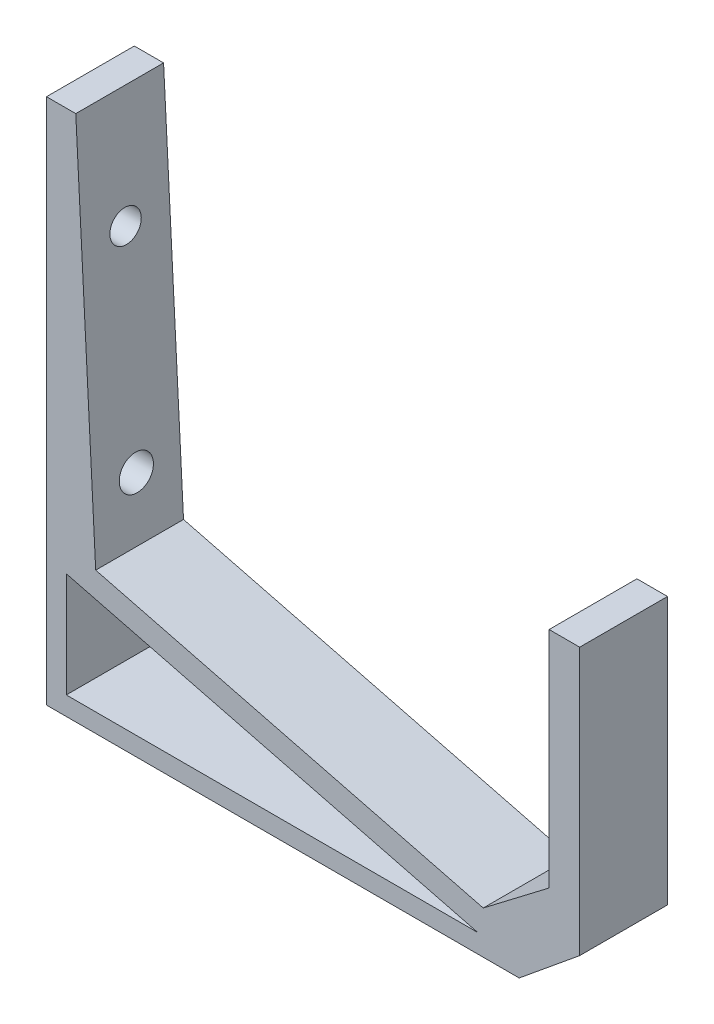
ISO-10303-21;
HEADER;
FILE_DESCRIPTION(('STEP AP214'),'2;1');
FILE_NAME('part.step','',(''),(''),'','','');
FILE_SCHEMA(('AUTOMOTIVE_DESIGN { 1 0 10303 214 1 1 1 1 }'));
ENDSEC;
DATA;
#1=APPLICATION_CONTEXT('core data for automotive mechanical design processes');
#2=APPLICATION_PROTOCOL_DEFINITION('international standard','automotive_design',2000,#1);
#3=PRODUCT_CONTEXT('',#1,'mechanical');
#4=PRODUCT('Part','Part','',(#3));
#5=PRODUCT_RELATED_PRODUCT_CATEGORY('part','',(#4));
#6=PRODUCT_DEFINITION_FORMATION('','',#4);
#7=PRODUCT_DEFINITION_CONTEXT('part definition',#1,'design');
#8=PRODUCT_DEFINITION('design','',#6,#7);
#9=PRODUCT_DEFINITION_SHAPE('','',#8);
#10=(LENGTH_UNIT() NAMED_UNIT(*) SI_UNIT(.MILLI.,.METRE.));
#11=(NAMED_UNIT(*) PLANE_ANGLE_UNIT() SI_UNIT($,.RADIAN.));
#12=(NAMED_UNIT(*) SI_UNIT($,.STERADIAN.) SOLID_ANGLE_UNIT());
#13=UNCERTAINTY_MEASURE_WITH_UNIT(LENGTH_MEASURE(1.E-05),#10,'distance_accuracy_value','');
#14=(GEOMETRIC_REPRESENTATION_CONTEXT(3) GLOBAL_UNCERTAINTY_ASSIGNED_CONTEXT((#13)) GLOBAL_UNIT_ASSIGNED_CONTEXT((#10,
#11,#12)) REPRESENTATION_CONTEXT('',''));
#15=CARTESIAN_POINT('',(0.,0.,0.));
#16=DIRECTION('',(0.,0.,1.));
#17=DIRECTION('',(1.,0.,0.));
#18=AXIS2_PLACEMENT_3D('',#15,#16,#17);
#19=CARTESIAN_POINT('',(-14.0501921057761,-161.551624937794,30.));
#20=DIRECTION('',(1.,0.,0.));
#21=DIRECTION('',(0.,0.,-1.));
#22=AXIS2_PLACEMENT_3D('',#19,#20,#21);
#23=PLANE('',#22);
#24=CARTESIAN_POINT('',(-14.0501921057761,-21.2644256031496,15.0372413331752));
#25=DIRECTION('',(-1.,0.,0.));
#26=DIRECTION('',(0.,0.,1.));
#27=AXIS2_PLACEMENT_3D('',#24,#25,#26);
#28=CIRCLE('',#27,5.35126695541521);
#29=CARTESIAN_POINT('',(-14.0501921057761,-21.2644256031496,20.3885082885904));
#30=VERTEX_POINT('',#29);
#31=EDGE_CURVE('E153',#30,#30,#28,.T.);
#32=ORIENTED_EDGE('',*,*,#31,.F.);
#33=EDGE_LOOP('',(#32));
#34=FACE_BOUND('',#33,.T.);
#35=CARTESIAN_POINT('',(-14.0501921057761,-92.3376479563416,15.0372413331752));
#36=DIRECTION('',(-1.,0.,0.));
#37=DIRECTION('',(0.,0.,1.));
#38=AXIS2_PLACEMENT_3D('',#35,#36,#37);
#39=CIRCLE('',#38,5.83284376795959);
#40=CARTESIAN_POINT('',(-14.0501921057761,-92.3376479563416,20.8700851011348));
#41=VERTEX_POINT('',#40);
#42=EDGE_CURVE('E163',#41,#41,#39,.T.);
#43=ORIENTED_EDGE('',*,*,#42,.F.);
#44=EDGE_LOOP('',(#43));
#45=FACE_BOUND('',#44,.T.);
#46=DIRECTION('',(0.,-1.,0.));
#47=VECTOR('',#46,1.);
#48=CARTESIAN_POINT('',(-14.0501921057761,-161.551624937794,0.));
#49=LINE('',#48,#47);
#50=CARTESIAN_POINT('',(-14.0501921057761,18.4483750622061,0.));
#51=VERTEX_POINT('',#50);
#52=CARTESIAN_POINT('',(-14.0501921057761,-161.551624937794,0.));
#53=VERTEX_POINT('',#52);
#54=EDGE_CURVE('E166',#51,#53,#49,.T.);
#55=ORIENTED_EDGE('',*,*,#54,.T.);
#56=DIRECTION('',(0.,0.,-1.));
#57=VECTOR('',#56,1.);
#58=CARTESIAN_POINT('',(-14.0501921057761,-161.551624937794,30.));
#59=LINE('',#58,#57);
#60=CARTESIAN_POINT('',(-14.0501921057761,-161.551624937794,30.));
#61=VERTEX_POINT('',#60);
#62=EDGE_CURVE('E11',#61,#53,#59,.T.);
#63=ORIENTED_EDGE('',*,*,#62,.F.);
#64=DIRECTION('',(0.,-1.,0.));
#65=VECTOR('',#64,1.);
#66=CARTESIAN_POINT('',(-14.0501921057761,-161.551624937794,30.));
#67=LINE('',#66,#65);
#68=CARTESIAN_POINT('',(-14.0501921057761,18.4483750622061,30.));
#69=VERTEX_POINT('',#68);
#70=EDGE_CURVE('E167',#69,#61,#67,.T.);
#71=ORIENTED_EDGE('',*,*,#70,.F.);
#72=DIRECTION('',(0.,0.,-1.));
#73=VECTOR('',#72,1.);
#74=CARTESIAN_POINT('',(-14.0501921057761,18.4483750622061,30.));
#75=LINE('',#74,#73);
#76=EDGE_CURVE('E189',#69,#51,#75,.T.);
#77=ORIENTED_EDGE('',*,*,#76,.T.);
#78=EDGE_LOOP('',(#55,#63,#71,#77));
#79=FACE_BOUND('',#78,.T.);
#80=ADVANCED_FACE('F33',(#34,#45,#79),#23,.F.);
#81=CARTESIAN_POINT('',(147.431500322869,-161.551624937794,30.));
#82=DIRECTION('',(0.,1.,0.));
#83=DIRECTION('',(-1.,0.,0.));
#84=AXIS2_PLACEMENT_3D('',#81,#82,#83);
#85=PLANE('',#84);
#86=DIRECTION('',(1.,0.,0.));
#87=VECTOR('',#86,1.);
#88=CARTESIAN_POINT('',(147.431500322869,-161.551624937794,0.));
#89=LINE('',#88,#87);
#90=CARTESIAN_POINT('',(147.431500322869,-161.551624937794,0.));
#91=VERTEX_POINT('',#90);
#92=EDGE_CURVE('E192',#53,#91,#89,.T.);
#93=ORIENTED_EDGE('',*,*,#92,.T.);
#94=DIRECTION('',(0.,0.,-1.));
#95=VECTOR('',#94,1.);
#96=CARTESIAN_POINT('',(147.431500322869,-161.551624937794,30.));
#97=LINE('',#96,#95);
#98=CARTESIAN_POINT('',(147.431500322869,-161.551624937794,30.));
#99=VERTEX_POINT('',#98);
#100=EDGE_CURVE('E40',#99,#91,#97,.T.);
#101=ORIENTED_EDGE('',*,*,#100,.F.);
#102=DIRECTION('',(1.,0.,0.));
#103=VECTOR('',#102,1.);
#104=CARTESIAN_POINT('',(147.431500322869,-161.551624937794,30.));
#105=LINE('',#104,#103);
#106=EDGE_CURVE('E170',#61,#99,#105,.T.);
#107=ORIENTED_EDGE('',*,*,#106,.F.);
#108=ORIENTED_EDGE('',*,*,#62,.T.);
#109=EDGE_LOOP('',(#93,#101,#107,#108));
#110=FACE_BOUND('',#109,.T.);
#111=ADVANCED_FACE('F257',(#110),#85,.F.);
#112=CARTESIAN_POINT('',(168.106392915954,-144.596025192141,30.));
#113=DIRECTION('',(-0.634128512454419,0.773227670025036,0.));
#114=DIRECTION('',(-0.773227670025036,-0.634128512454419,0.));
#115=AXIS2_PLACEMENT_3D('',#112,#113,#114);
#116=PLANE('',#115);
#117=DIRECTION('',(0.773227670025036,0.634128512454419,0.));
#118=VECTOR('',#117,1.);
#119=CARTESIAN_POINT('',(168.106392915954,-144.596025192141,0.));
#120=LINE('',#119,#118);
#121=CARTESIAN_POINT('',(168.106392915954,-144.596025192141,0.));
#122=VERTEX_POINT('',#121);
#123=EDGE_CURVE('E194',#91,#122,#120,.T.);
#124=ORIENTED_EDGE('',*,*,#123,.T.);
#125=DIRECTION('',(0.,0.,-1.));
#126=VECTOR('',#125,1.);
#127=CARTESIAN_POINT('',(168.106392915954,-144.596025192141,30.));
#128=LINE('',#127,#126);
#129=CARTESIAN_POINT('',(168.106392915954,-144.596025192141,30.));
#130=VERTEX_POINT('',#129);
#131=EDGE_CURVE('E229',#130,#122,#128,.T.);
#132=ORIENTED_EDGE('',*,*,#131,.F.);
#133=DIRECTION('',(0.773227670025036,0.634128512454419,0.));
#134=VECTOR('',#133,1.);
#135=CARTESIAN_POINT('',(168.106392915954,-144.596025192141,30.));
#136=LINE('',#135,#134);
#137=EDGE_CURVE('E173',#99,#130,#136,.T.);
#138=ORIENTED_EDGE('',*,*,#137,.F.);
#139=ORIENTED_EDGE('',*,*,#100,.T.);
#140=EDGE_LOOP('',(#124,#132,#138,#139));
#141=FACE_BOUND('',#140,.T.);
#142=ADVANCED_FACE('F236',(#141),#116,.F.);
#143=CARTESIAN_POINT('',(168.106392915954,-53.3330801081453,30.));
#144=DIRECTION('',(-1.,0.,0.));
#145=DIRECTION('',(0.,-1.,0.));
#146=AXIS2_PLACEMENT_3D('',#143,#144,#145);
#147=PLANE('',#146);
#148=DIRECTION('',(0.,1.,0.));
#149=VECTOR('',#148,1.);
#150=CARTESIAN_POINT('',(168.106392915954,-53.3330801081453,0.));
#151=LINE('',#150,#149);
#152=CARTESIAN_POINT('',(168.106392915954,-53.3330801081453,0.));
#153=VERTEX_POINT('',#152);
#154=EDGE_CURVE('E196',#122,#153,#151,.T.);
#155=ORIENTED_EDGE('',*,*,#154,.T.);
#156=DIRECTION('',(0.,0.,-1.));
#157=VECTOR('',#156,1.);
#158=CARTESIAN_POINT('',(168.106392915954,-53.3330801081453,30.));
#159=LINE('',#158,#157);
#160=CARTESIAN_POINT('',(168.106392915954,-53.3330801081453,30.));
#161=VERTEX_POINT('',#160);
#162=EDGE_CURVE('E226',#161,#153,#159,.T.);
#163=ORIENTED_EDGE('',*,*,#162,.F.);
#164=DIRECTION('',(0.,1.,0.));
#165=VECTOR('',#164,1.);
#166=CARTESIAN_POINT('',(168.106392915954,-53.3330801081453,30.));
#167=LINE('',#166,#165);
#168=EDGE_CURVE('E175',#130,#161,#167,.T.);
#169=ORIENTED_EDGE('',*,*,#168,.F.);
#170=ORIENTED_EDGE('',*,*,#131,.T.);
#171=EDGE_LOOP('',(#155,#163,#169,#170));
#172=FACE_BOUND('',#171,.T.);
#173=ADVANCED_FACE('F245',(#172),#147,.F.);
#174=CARTESIAN_POINT('',(157.659448916992,-53.3330801081453,30.));
#175=DIRECTION('',(0.,-1.,0.));
#176=DIRECTION('',(0.,0.,-1.));
#177=AXIS2_PLACEMENT_3D('',#174,#175,#176);
#178=PLANE('',#177);
#179=DIRECTION('',(-1.,0.,0.));
#180=VECTOR('',#179,1.);
#181=CARTESIAN_POINT('',(157.659448916992,-53.3330801081453,0.));
#182=LINE('',#181,#180);
#183=CARTESIAN_POINT('',(157.659448916992,-53.3330801081453,0.));
#184=VERTEX_POINT('',#183);
#185=EDGE_CURVE('E198',#153,#184,#182,.T.);
#186=ORIENTED_EDGE('',*,*,#185,.T.);
#187=DIRECTION('',(0.,0.,-1.));
#188=VECTOR('',#187,1.);
#189=CARTESIAN_POINT('',(157.659448916992,-53.3330801081453,30.));
#190=LINE('',#189,#188);
#191=CARTESIAN_POINT('',(157.659448916992,-53.3330801081453,30.));
#192=VERTEX_POINT('',#191);
#193=EDGE_CURVE('E223',#192,#184,#190,.T.);
#194=ORIENTED_EDGE('',*,*,#193,.F.);
#195=DIRECTION('',(-1.,0.,0.));
#196=VECTOR('',#195,1.);
#197=CARTESIAN_POINT('',(157.659448916992,-53.3330801081453,30.));
#198=LINE('',#197,#196);
#199=EDGE_CURVE('E177',#161,#192,#198,.T.);
#200=ORIENTED_EDGE('',*,*,#199,.F.);
#201=ORIENTED_EDGE('',*,*,#162,.T.);
#202=EDGE_LOOP('',(#186,#194,#200,#201));
#203=FACE_BOUND('',#202,.T.);
#204=ADVANCED_FACE('F249',(#203),#178,.F.);
#205=CARTESIAN_POINT('',(157.659448916992,-129.804321413943,30.));
#206=DIRECTION('',(1.,0.,0.));
#207=DIRECTION('',(0.,0.,-1.));
#208=AXIS2_PLACEMENT_3D('',#205,#206,#207);
#209=PLANE('',#208);
#210=DIRECTION('',(0.,-1.,0.));
#211=VECTOR('',#210,1.);
#212=CARTESIAN_POINT('',(157.659448916992,-129.804321413943,0.));
#213=LINE('',#212,#211);
#214=CARTESIAN_POINT('',(157.659448916992,-129.804321413943,0.));
#215=VERTEX_POINT('',#214);
#216=EDGE_CURVE('E200',#184,#215,#213,.T.);
#217=ORIENTED_EDGE('',*,*,#216,.T.);
#218=DIRECTION('',(0.,0.,-1.));
#219=VECTOR('',#218,1.);
#220=CARTESIAN_POINT('',(157.659448916992,-129.804321413943,30.));
#221=LINE('',#220,#219);
#222=CARTESIAN_POINT('',(157.659448916992,-129.804321413943,30.));
#223=VERTEX_POINT('',#222);
#224=EDGE_CURVE('E220',#223,#215,#221,.T.);
#225=ORIENTED_EDGE('',*,*,#224,.F.);
#226=DIRECTION('',(0.,-1.,0.));
#227=VECTOR('',#226,1.);
#228=CARTESIAN_POINT('',(157.659448916992,-129.804321413943,30.));
#229=LINE('',#228,#227);
#230=EDGE_CURVE('E179',#192,#223,#229,.T.);
#231=ORIENTED_EDGE('',*,*,#230,.F.);
#232=ORIENTED_EDGE('',*,*,#193,.T.);
#233=EDGE_LOOP('',(#217,#225,#231,#232));
#234=FACE_BOUND('',#233,.T.);
#235=ADVANCED_FACE('F280',(#234),#209,.F.);
#236=CARTESIAN_POINT('',(135.150414635434,-146.982486488192,30.));
#237=DIRECTION('',(0.606678181606339,-0.794947535352382,0.));
#238=DIRECTION('',(0.794947535352382,0.606678181606339,0.));
#239=AXIS2_PLACEMENT_3D('',#236,#237,#238);
#240=PLANE('',#239);
#241=DIRECTION('',(-0.794947535352382,-0.606678181606339,0.));
#242=VECTOR('',#241,1.);
#243=CARTESIAN_POINT('',(135.150414635434,-146.982486488192,0.));
#244=LINE('',#243,#242);
#245=CARTESIAN_POINT('',(135.150414635434,-146.982486488192,0.));
#246=VERTEX_POINT('',#245);
#247=EDGE_CURVE('E202',#215,#246,#244,.T.);
#248=ORIENTED_EDGE('',*,*,#247,.T.);
#249=DIRECTION('',(0.,0.,-1.));
#250=VECTOR('',#249,1.);
#251=CARTESIAN_POINT('',(135.150414635434,-146.982486488192,30.));
#252=LINE('',#251,#250);
#253=CARTESIAN_POINT('',(135.150414635434,-146.982486488192,30.));
#254=VERTEX_POINT('',#253);
#255=EDGE_CURVE('E217',#254,#246,#252,.T.);
#256=ORIENTED_EDGE('',*,*,#255,.F.);
#257=DIRECTION('',(-0.794947535352382,-0.606678181606339,0.));
#258=VECTOR('',#257,1.);
#259=CARTESIAN_POINT('',(135.150414635434,-146.982486488192,30.));
#260=LINE('',#259,#258);
#261=EDGE_CURVE('E181',#223,#254,#260,.T.);
#262=ORIENTED_EDGE('',*,*,#261,.F.);
#263=ORIENTED_EDGE('',*,*,#224,.T.);
#264=EDGE_LOOP('',(#248,#256,#262,#263));
#265=FACE_BOUND('',#264,.T.);
#266=ADVANCED_FACE('F277',(#265),#240,.F.);
#267=CARTESIAN_POINT('',(2.76175247943167,-113.222934173669,30.));
#268=DIRECTION('',(-0.24709595492336,-0.968991015985449,0.));
#269=DIRECTION('',(0.968991015985449,-0.24709595492336,0.));
#270=AXIS2_PLACEMENT_3D('',#267,#268,#269);
#271=PLANE('',#270);
#272=DIRECTION('',(-0.968991015985449,0.24709595492336,0.));
#273=VECTOR('',#272,1.);
#274=CARTESIAN_POINT('',(2.76175247943167,-113.222934173669,0.));
#275=LINE('',#274,#273);
#276=CARTESIAN_POINT('',(2.76175247943167,-113.222934173669,0.));
#277=VERTEX_POINT('',#276);
#278=EDGE_CURVE('E204',#246,#277,#275,.T.);
#279=ORIENTED_EDGE('',*,*,#278,.T.);
#280=DIRECTION('',(0.,0.,-1.));
#281=VECTOR('',#280,1.);
#282=CARTESIAN_POINT('',(2.76175247943167,-113.222934173669,30.));
#283=LINE('',#282,#281);
#284=CARTESIAN_POINT('',(2.76175247943167,-113.222934173669,30.));
#285=VERTEX_POINT('',#284);
#286=EDGE_CURVE('E214',#285,#277,#283,.T.);
#287=ORIENTED_EDGE('',*,*,#286,.F.);
#288=DIRECTION('',(-0.968991015985449,0.24709595492336,0.));
#289=VECTOR('',#288,1.);
#290=CARTESIAN_POINT('',(2.76175247943167,-113.222934173669,30.));
#291=LINE('',#290,#289);
#292=EDGE_CURVE('E183',#254,#285,#291,.T.);
#293=ORIENTED_EDGE('',*,*,#292,.F.);
#294=ORIENTED_EDGE('',*,*,#255,.T.);
#295=EDGE_LOOP('',(#279,#287,#293,#294));
#296=FACE_BOUND('',#295,.T.);
#297=ADVANCED_FACE('F273',(#296),#271,.F.);
#298=CARTESIAN_POINT('',(-4.05019210577608,18.4483750622061,30.));
#299=DIRECTION('',(-0.998664452927408,-0.0516653700190049,0.));
#300=DIRECTION('',(0.0516653700190049,-0.998664452927408,0.));
#301=AXIS2_PLACEMENT_3D('',#298,#299,#300);
#302=PLANE('',#301);
#303=CARTESIAN_POINT('',(-1.99567165613743,-21.2644256031496,15.0372413331752));
#304=DIRECTION('',(-0.998664452927408,-0.0516653700190049,0.));
#305=DIRECTION('',(-0.0516653700190049,0.998664452927408,0.));
#306=AXIS2_PLACEMENT_3D('',#303,#304,#305);
#307=ELLIPSE('',#306,5.35842338207685,5.35126695541521);
#308=CARTESIAN_POINT('',(-2.27251658289091,-15.9131586477343,15.0372413331752));
#309=VERTEX_POINT('',#308);
#310=EDGE_CURVE('E157',#309,#309,#307,.F.);
#311=ORIENTED_EDGE('',*,*,#310,.F.);
#312=EDGE_LOOP('',(#311));
#313=FACE_BOUND('',#312,.T.);
#314=CARTESIAN_POINT('',(1.68126339502697,-92.3376479563416,15.0372413331752));
#315=DIRECTION('',(-0.998664452927408,-0.0516653700190049,0.));
#316=DIRECTION('',(-0.0516653700190049,0.998664452927408,0.));
#317=AXIS2_PLACEMENT_3D('',#314,#315,#316);
#318=ELLIPSE('',#317,5.84064422325401,5.83284376795959);
#319=CARTESIAN_POINT('',(1.37950435008319,-86.504804188382,15.0372413331752));
#320=VERTEX_POINT('',#319);
#321=EDGE_CURVE('E160',#320,#320,#318,.F.);
#322=ORIENTED_EDGE('',*,*,#321,.F.);
#323=EDGE_LOOP('',(#322));
#324=FACE_BOUND('',#323,.T.);
#325=DIRECTION('',(-0.0516653700190049,0.998664452927408,0.));
#326=VECTOR('',#325,1.);
#327=CARTESIAN_POINT('',(-4.05019210577608,18.4483750622061,0.));
#328=LINE('',#327,#326);
#329=CARTESIAN_POINT('',(-4.05019210577608,18.4483750622061,0.));
#330=VERTEX_POINT('',#329);
#331=EDGE_CURVE('E206',#277,#330,#328,.T.);
#332=ORIENTED_EDGE('',*,*,#331,.T.);
#333=DIRECTION('',(0.,0.,-1.));
#334=VECTOR('',#333,1.);
#335=CARTESIAN_POINT('',(-4.05019210577608,18.4483750622061,30.));
#336=LINE('',#335,#334);
#337=CARTESIAN_POINT('',(-4.05019210577608,18.4483750622061,30.));
#338=VERTEX_POINT('',#337);
#339=EDGE_CURVE('E211',#338,#330,#336,.T.);
#340=ORIENTED_EDGE('',*,*,#339,.F.);
#341=DIRECTION('',(-0.0516653700190049,0.998664452927408,0.));
#342=VECTOR('',#341,1.);
#343=CARTESIAN_POINT('',(-4.05019210577608,18.4483750622061,30.));
#344=LINE('',#343,#342);
#345=EDGE_CURVE('E185',#285,#338,#344,.T.);
#346=ORIENTED_EDGE('',*,*,#345,.F.);
#347=ORIENTED_EDGE('',*,*,#286,.T.);
#348=EDGE_LOOP('',(#332,#340,#346,#347));
#349=FACE_BOUND('',#348,.T.);
#350=ADVANCED_FACE('F269',(#313,#324,#349),#302,.F.);
#351=CARTESIAN_POINT('',(-14.0501921057761,18.4483750622061,30.));
#352=DIRECTION('',(0.,-1.,0.));
#353=DIRECTION('',(0.,0.,-1.));
#354=AXIS2_PLACEMENT_3D('',#351,#352,#353);
#355=PLANE('',#354);
#356=DIRECTION('',(-1.,0.,0.));
#357=VECTOR('',#356,1.);
#358=CARTESIAN_POINT('',(-14.0501921057761,18.4483750622061,0.));
#359=LINE('',#358,#357);
#360=EDGE_CURVE('E171',#330,#51,#359,.T.);
#361=ORIENTED_EDGE('',*,*,#360,.T.);
#362=ORIENTED_EDGE('',*,*,#76,.F.);
#363=DIRECTION('',(-1.,0.,0.));
#364=VECTOR('',#363,1.);
#365=CARTESIAN_POINT('',(-14.0501921057761,18.4483750622061,30.));
#366=LINE('',#365,#364);
#367=EDGE_CURVE('E187',#338,#69,#366,.T.);
#368=ORIENTED_EDGE('',*,*,#367,.F.);
#369=ORIENTED_EDGE('',*,*,#339,.T.);
#370=EDGE_LOOP('',(#361,#362,#368,#369));
#371=FACE_BOUND('',#370,.T.);
#372=ADVANCED_FACE('F264',(#371),#355,.F.);
#373=CARTESIAN_POINT('',(0.,0.,30.));
#374=DIRECTION('',(0.,0.,-1.));
#375=DIRECTION('',(-1.,0.,0.));
#376=AXIS2_PLACEMENT_3D('',#373,#374,#375);
#377=PLANE('',#376);
#378=DIRECTION('',(1.,0.,0.));
#379=VECTOR('',#378,1.);
#380=CARTESIAN_POINT('',(133.336369924999,-155.163928003535,30.));
#381=LINE('',#380,#379);
#382=CARTESIAN_POINT('',(-7.2867069338205,-155.163928003535,30.));
#383=VERTEX_POINT('',#382);
#384=CARTESIAN_POINT('',(133.336369924999,-155.163928003535,30.));
#385=VERTEX_POINT('',#384);
#386=EDGE_CURVE('E145',#383,#385,#381,.T.);
#387=ORIENTED_EDGE('',*,*,#386,.F.);
#388=DIRECTION('',(0.,-1.,0.));
#389=VECTOR('',#388,1.);
#390=CARTESIAN_POINT('',(-7.2867069338205,-155.163928003535,30.));
#391=LINE('',#390,#389);
#392=CARTESIAN_POINT('',(-7.2867069338205,-119.304572356823,30.));
#393=VERTEX_POINT('',#392);
#394=EDGE_CURVE('E47',#393,#383,#391,.T.);
#395=ORIENTED_EDGE('',*,*,#394,.F.);
#396=DIRECTION('',(-0.968991015985449,0.24709595492336,0.));
#397=VECTOR('',#396,1.);
#398=CARTESIAN_POINT('',(-7.2867069338205,-119.304572356823,30.));
#399=LINE('',#398,#397);
#400=EDGE_CURVE('E142',#385,#393,#399,.T.);
#401=ORIENTED_EDGE('',*,*,#400,.F.);
#402=EDGE_LOOP('',(#387,#395,#401));
#403=FACE_BOUND('',#402,.T.);
#404=ORIENTED_EDGE('',*,*,#70,.T.);
#405=ORIENTED_EDGE('',*,*,#106,.T.);
#406=ORIENTED_EDGE('',*,*,#137,.T.);
#407=ORIENTED_EDGE('',*,*,#168,.T.);
#408=ORIENTED_EDGE('',*,*,#199,.T.);
#409=ORIENTED_EDGE('',*,*,#230,.T.);
#410=ORIENTED_EDGE('',*,*,#261,.T.);
#411=ORIENTED_EDGE('',*,*,#292,.T.);
#412=ORIENTED_EDGE('',*,*,#345,.T.);
#413=ORIENTED_EDGE('',*,*,#367,.T.);
#414=EDGE_LOOP('',(#404,#405,#406,#407,#408,#409,#410,#411,#412,#413));
#415=FACE_BOUND('',#414,.T.);
#416=ADVANCED_FACE('F253',(#403,#415),#377,.F.);
#417=CARTESIAN_POINT('',(0.,0.,0.));
#418=DIRECTION('',(0.,0.,-1.));
#419=DIRECTION('',(-1.,0.,0.));
#420=AXIS2_PLACEMENT_3D('',#417,#418,#419);
#421=PLANE('',#420);
#422=DIRECTION('',(0.,-1.,0.));
#423=VECTOR('',#422,1.);
#424=CARTESIAN_POINT('',(-7.2867069338205,-155.163928003535,0.));
#425=LINE('',#424,#423);
#426=CARTESIAN_POINT('',(-7.2867069338205,-119.304572356823,0.));
#427=VERTEX_POINT('',#426);
#428=CARTESIAN_POINT('',(-7.2867069338205,-155.163928003535,0.));
#429=VERTEX_POINT('',#428);
#430=EDGE_CURVE('E129',#427,#429,#425,.T.);
#431=ORIENTED_EDGE('',*,*,#430,.T.);
#432=DIRECTION('',(1.,0.,0.));
#433=VECTOR('',#432,1.);
#434=CARTESIAN_POINT('',(133.336369924999,-155.163928003535,0.));
#435=LINE('',#434,#433);
#436=CARTESIAN_POINT('',(133.336369924999,-155.163928003535,0.));
#437=VERTEX_POINT('',#436);
#438=EDGE_CURVE('E136',#429,#437,#435,.T.);
#439=ORIENTED_EDGE('',*,*,#438,.T.);
#440=DIRECTION('',(-0.968991015985449,0.24709595492336,0.));
#441=VECTOR('',#440,1.);
#442=CARTESIAN_POINT('',(-7.2867069338205,-119.304572356823,0.));
#443=LINE('',#442,#441);
#444=EDGE_CURVE('E55',#437,#427,#443,.T.);
#445=ORIENTED_EDGE('',*,*,#444,.T.);
#446=EDGE_LOOP('',(#431,#439,#445));
#447=FACE_BOUND('',#446,.T.);
#448=ORIENTED_EDGE('',*,*,#54,.F.);
#449=ORIENTED_EDGE('',*,*,#360,.F.);
#450=ORIENTED_EDGE('',*,*,#331,.F.);
#451=ORIENTED_EDGE('',*,*,#278,.F.);
#452=ORIENTED_EDGE('',*,*,#247,.F.);
#453=ORIENTED_EDGE('',*,*,#216,.F.);
#454=ORIENTED_EDGE('',*,*,#185,.F.);
#455=ORIENTED_EDGE('',*,*,#154,.F.);
#456=ORIENTED_EDGE('',*,*,#123,.F.);
#457=ORIENTED_EDGE('',*,*,#92,.F.);
#458=EDGE_LOOP('',(#448,#449,#450,#451,#452,#453,#454,#455,#456,#457));
#459=FACE_BOUND('',#458,.T.);
#460=ADVANCED_FACE('F140',(#447,#459),#421,.T.);
#461=CARTESIAN_POINT('',(168.107392915954,-92.3376479563416,15.0372413331752));
#462=DIRECTION('',(-1.,0.,0.));
#463=DIRECTION('',(0.,0.,1.));
#464=AXIS2_PLACEMENT_3D('',#461,#462,#463);
#465=CYLINDRICAL_SURFACE('',#464,5.83284376795959);
#466=ORIENTED_EDGE('',*,*,#42,.T.);
#467=EDGE_LOOP('',(#466));
#468=FACE_BOUND('',#467,.T.);
#469=ORIENTED_EDGE('',*,*,#321,.T.);
#470=EDGE_LOOP('',(#469));
#471=FACE_BOUND('',#470,.T.);
#472=ADVANCED_FACE('F298',(#468,#471),#465,.F.);
#473=CARTESIAN_POINT('',(168.107392915954,-21.2644256031496,15.0372413331752));
#474=DIRECTION('',(-1.,0.,0.));
#475=DIRECTION('',(0.,0.,1.));
#476=AXIS2_PLACEMENT_3D('',#473,#474,#475);
#477=CYLINDRICAL_SURFACE('',#476,5.35126695541521);
#478=ORIENTED_EDGE('',*,*,#31,.T.);
#479=EDGE_LOOP('',(#478));
#480=FACE_BOUND('',#479,.T.);
#481=ORIENTED_EDGE('',*,*,#310,.T.);
#482=EDGE_LOOP('',(#481));
#483=FACE_BOUND('',#482,.T.);
#484=ADVANCED_FACE('F301',(#480,#483),#477,.F.);
#485=CARTESIAN_POINT('',(-7.2867069338205,-155.163928003535,0.));
#486=DIRECTION('',(-1.,0.,0.));
#487=DIRECTION('',(0.,0.,1.));
#488=AXIS2_PLACEMENT_3D('',#485,#486,#487);
#489=PLANE('',#488);
#490=ORIENTED_EDGE('',*,*,#394,.T.);
#491=DIRECTION('',(0.,0.,1.));
#492=VECTOR('',#491,1.);
#493=CARTESIAN_POINT('',(-7.2867069338205,-155.163928003535,0.));
#494=LINE('',#493,#492);
#495=EDGE_CURVE('E125',#429,#383,#494,.T.);
#496=ORIENTED_EDGE('',*,*,#495,.F.);
#497=ORIENTED_EDGE('',*,*,#430,.F.);
#498=DIRECTION('',(0.,0.,1.));
#499=VECTOR('',#498,1.);
#500=CARTESIAN_POINT('',(-7.2867069338205,-119.304572356823,0.));
#501=LINE('',#500,#499);
#502=EDGE_CURVE('E151',#427,#393,#501,.T.);
#503=ORIENTED_EDGE('',*,*,#502,.T.);
#504=EDGE_LOOP('',(#490,#496,#497,#503));
#505=FACE_BOUND('',#504,.T.);
#506=ADVANCED_FACE('F127',(#505),#489,.F.);
#507=CARTESIAN_POINT('',(-7.2867069338205,-119.304572356823,0.));
#508=DIRECTION('',(0.24709595492336,0.968991015985449,0.));
#509=DIRECTION('',(-0.968991015985449,0.24709595492336,0.));
#510=AXIS2_PLACEMENT_3D('',#507,#508,#509);
#511=PLANE('',#510);
#512=ORIENTED_EDGE('',*,*,#400,.T.);
#513=ORIENTED_EDGE('',*,*,#502,.F.);
#514=ORIENTED_EDGE('',*,*,#444,.F.);
#515=DIRECTION('',(0.,0.,1.));
#516=VECTOR('',#515,1.);
#517=CARTESIAN_POINT('',(133.336369924999,-155.163928003535,0.));
#518=LINE('',#517,#516);
#519=EDGE_CURVE('E133',#437,#385,#518,.T.);
#520=ORIENTED_EDGE('',*,*,#519,.T.);
#521=EDGE_LOOP('',(#512,#513,#514,#520));
#522=FACE_BOUND('',#521,.T.);
#523=ADVANCED_FACE('F326',(#522),#511,.F.);
#524=CARTESIAN_POINT('',(133.336369924999,-155.163928003535,0.));
#525=DIRECTION('',(0.,-1.,0.));
#526=DIRECTION('',(0.,0.,-1.));
#527=AXIS2_PLACEMENT_3D('',#524,#525,#526);
#528=PLANE('',#527);
#529=ORIENTED_EDGE('',*,*,#386,.T.);
#530=ORIENTED_EDGE('',*,*,#519,.F.);
#531=ORIENTED_EDGE('',*,*,#438,.F.);
#532=ORIENTED_EDGE('',*,*,#495,.T.);
#533=EDGE_LOOP('',(#529,#530,#531,#532));
#534=FACE_BOUND('',#533,.T.);
#535=ADVANCED_FACE('F137',(#534),#528,.F.);
#536=CLOSED_SHELL('',(#80,#111,#142,#173,#204,#235,#266,#297,#350,#372,#416,#460,#472,#484,#506,
#523,#535));
#537=MANIFOLD_SOLID_BREP('B2',#536);
#538=ADVANCED_BREP_SHAPE_REPRESENTATION('',(#18,#537),#14);
#539=SHAPE_DEFINITION_REPRESENTATION(#9,#538);
ENDSEC;
END-ISO-10303-21;
